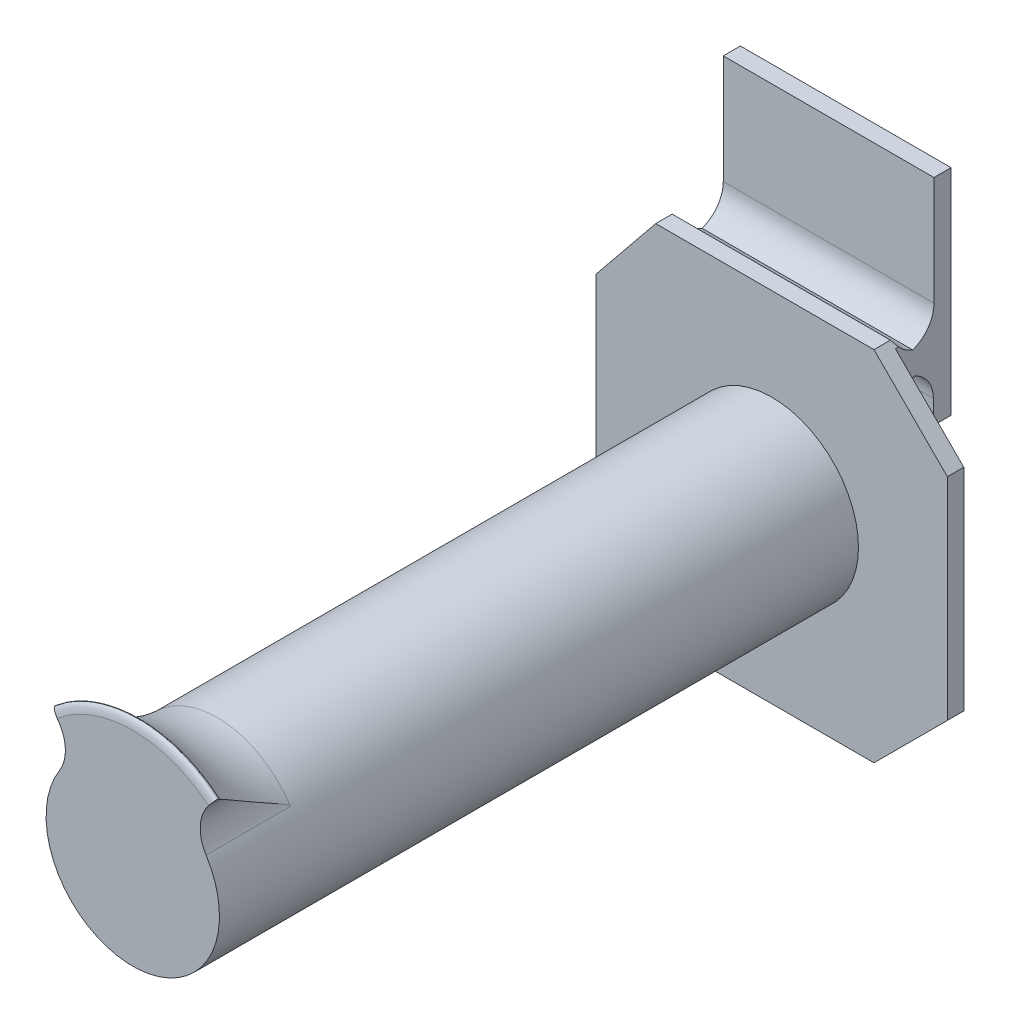
ISO-10303-21;
HEADER;
FILE_DESCRIPTION(('STEP AP214'),'2;1');
FILE_NAME('part.step','',(''),(''),'','','');
FILE_SCHEMA(('AUTOMOTIVE_DESIGN { 1 0 10303 214 1 1 1 1 }'));
ENDSEC;
DATA;
#1=APPLICATION_CONTEXT('core data for automotive mechanical design processes');
#2=APPLICATION_PROTOCOL_DEFINITION('international standard','automotive_design',2000,#1);
#3=PRODUCT_CONTEXT('',#1,'mechanical');
#4=PRODUCT('Part','Part','',(#3));
#5=PRODUCT_RELATED_PRODUCT_CATEGORY('part','',(#4));
#6=PRODUCT_DEFINITION_FORMATION('','',#4);
#7=PRODUCT_DEFINITION_CONTEXT('part definition',#1,'design');
#8=PRODUCT_DEFINITION('design','',#6,#7);
#9=PRODUCT_DEFINITION_SHAPE('','',#8);
#10=(LENGTH_UNIT() NAMED_UNIT(*) SI_UNIT(.MILLI.,.METRE.));
#11=(NAMED_UNIT(*) PLANE_ANGLE_UNIT() SI_UNIT($,.RADIAN.));
#12=(NAMED_UNIT(*) SI_UNIT($,.STERADIAN.) SOLID_ANGLE_UNIT());
#13=UNCERTAINTY_MEASURE_WITH_UNIT(LENGTH_MEASURE(1.E-05),#10,'distance_accuracy_value','');
#14=(GEOMETRIC_REPRESENTATION_CONTEXT(3) GLOBAL_UNCERTAINTY_ASSIGNED_CONTEXT((#13)) GLOBAL_UNIT_ASSIGNED_CONTEXT((#10,
#11,#12)) REPRESENTATION_CONTEXT('',''));
#15=CARTESIAN_POINT('',(0.,0.,0.));
#16=DIRECTION('',(0.,0.,1.));
#17=DIRECTION('',(1.,0.,0.));
#18=AXIS2_PLACEMENT_3D('',#15,#16,#17);
#19=CARTESIAN_POINT('',(0.,0.,0.));
#20=DIRECTION('',(0.,0.,1.));
#21=DIRECTION('',(1.,0.,0.));
#22=AXIS2_PLACEMENT_3D('',#19,#20,#21);
#23=PLANE('',#22);
#24=CARTESIAN_POINT('',(0.,0.,0.));
#25=DIRECTION('',(0.,0.,1.));
#26=DIRECTION('',(1.,0.,0.));
#27=AXIS2_PLACEMENT_3D('',#24,#25,#26);
#28=CIRCLE('',#27,13.7);
#29=CARTESIAN_POINT('',(13.7,0.,0.));
#30=VERTEX_POINT('',#29);
#31=EDGE_CURVE('E414',#30,#30,#28,.T.);
#32=ORIENTED_EDGE('',*,*,#31,.F.);
#33=EDGE_LOOP('',(#32));
#34=FACE_BOUND('',#33,.T.);
#35=DIRECTION('',(0.,-1.,0.));
#36=VECTOR('',#35,1.);
#37=CARTESIAN_POINT('',(27.75,28.280672501964,0.));
#38=LINE('',#37,#36);
#39=CARTESIAN_POINT('',(27.75,16.6806725019641,0.));
#40=VERTEX_POINT('',#39);
#41=CARTESIAN_POINT('',(27.75,-16.6806725019641,0.));
#42=VERTEX_POINT('',#41);
#43=EDGE_CURVE('E419',#40,#42,#38,.T.);
#44=ORIENTED_EDGE('',*,*,#43,.F.);
#45=DIRECTION('',(0.707106781186551,-0.707106781186544,0.));
#46=VECTOR('',#45,1.);
#47=CARTESIAN_POINT('',(16.15,28.280672501964,0.));
#48=LINE('',#47,#46);
#49=CARTESIAN_POINT('',(16.15,28.280672501964,0.));
#50=VERTEX_POINT('',#49);
#51=EDGE_CURVE('E365',#50,#40,#48,.T.);
#52=ORIENTED_EDGE('',*,*,#51,.F.);
#53=DIRECTION('',(1.,0.,0.));
#54=VECTOR('',#53,1.);
#55=CARTESIAN_POINT('',(-27.75,28.280672501964,0.));
#56=LINE('',#55,#54);
#57=CARTESIAN_POINT('',(-18.35,28.280672501964,0.));
#58=VERTEX_POINT('',#57);
#59=EDGE_CURVE('E406',#58,#50,#56,.T.);
#60=ORIENTED_EDGE('',*,*,#59,.F.);
#61=DIRECTION('',(0.629583498277007,0.77693282766098,0.));
#62=VECTOR('',#61,1.);
#63=CARTESIAN_POINT('',(-24.9098354997943,20.1855563532818,0.));
#64=LINE('',#63,#62);
#65=CARTESIAN_POINT('',(-27.75,16.6806725019641,0.));
#66=VERTEX_POINT('',#65);
#67=EDGE_CURVE('E392',#66,#58,#64,.T.);
#68=ORIENTED_EDGE('',*,*,#67,.F.);
#69=DIRECTION('',(0.,-1.,0.));
#70=VECTOR('',#69,1.);
#71=CARTESIAN_POINT('',(-27.75,28.280672501964,0.));
#72=LINE('',#71,#70);
#73=CARTESIAN_POINT('',(-27.75,-18.8806725019639,0.));
#74=VERTEX_POINT('',#73);
#75=EDGE_CURVE('E399',#66,#74,#72,.T.);
#76=ORIENTED_EDGE('',*,*,#75,.T.);
#77=DIRECTION('',(-0.707106781186545,0.70710678118655,0.));
#78=VECTOR('',#77,1.);
#79=CARTESIAN_POINT('',(-23.315336250982,-23.3153362509819,0.));
#80=LINE('',#79,#78);
#81=CARTESIAN_POINT('',(-18.35,-28.280672501964,0.));
#82=VERTEX_POINT('',#81);
#83=EDGE_CURVE('E373',#82,#74,#80,.T.);
#84=ORIENTED_EDGE('',*,*,#83,.F.);
#85=DIRECTION('',(1.,0.,0.));
#86=VECTOR('',#85,1.);
#87=CARTESIAN_POINT('',(-27.75,-28.280672501964,0.));
#88=LINE('',#87,#86);
#89=CARTESIAN_POINT('',(16.15,-28.280672501964,0.));
#90=VERTEX_POINT('',#89);
#91=EDGE_CURVE('E417',#82,#90,#88,.T.);
#92=ORIENTED_EDGE('',*,*,#91,.T.);
#93=DIRECTION('',(0.707106781186551,0.707106781186544,0.));
#94=VECTOR('',#93,1.);
#95=CARTESIAN_POINT('',(22.2153362509819,-22.2153362509821,0.));
#96=LINE('',#95,#94);
#97=EDGE_CURVE('E383',#90,#42,#96,.T.);
#98=ORIENTED_EDGE('',*,*,#97,.T.);
#99=EDGE_LOOP('',(#44,#52,#60,#68,#76,#84,#92,#98));
#100=FACE_BOUND('',#99,.T.);
#101=ADVANCED_FACE('F35',(#34,#100),#23,.T.);
#102=CARTESIAN_POINT('',(0.,0.,-2.6));
#103=DIRECTION('',(0.,0.,1.));
#104=DIRECTION('',(1.,0.,0.));
#105=AXIS2_PLACEMENT_3D('',#102,#103,#104);
#106=PLANE('',#105);
#107=DIRECTION('',(1.,0.,0.));
#108=VECTOR('',#107,1.);
#109=CARTESIAN_POINT('',(-27.75,28.280672501964,-2.6));
#110=LINE('',#109,#108);
#111=CARTESIAN_POINT('',(-18.35,28.280672501964,-2.6));
#112=VERTEX_POINT('',#111);
#113=CARTESIAN_POINT('',(-16.3666459952623,28.280672501964,-2.6));
#114=VERTEX_POINT('',#113);
#115=EDGE_CURVE('E411',#112,#114,#110,.T.);
#116=ORIENTED_EDGE('',*,*,#115,.T.);
#117=DIRECTION('',(0.,-1.,0.));
#118=VECTOR('',#117,1.);
#119=CARTESIAN_POINT('',(-16.3666459952623,25.680672501964,-2.6));
#120=LINE('',#119,#118);
#121=CARTESIAN_POINT('',(-16.3666459952623,17.680672501964,-2.6));
#122=VERTEX_POINT('',#121);
#123=EDGE_CURVE('E354',#114,#122,#120,.T.);
#124=ORIENTED_EDGE('',*,*,#123,.T.);
#125=DIRECTION('',(1.,0.,0.));
#126=VECTOR('',#125,1.);
#127=CARTESIAN_POINT('',(0.,17.680672501964,-2.6));
#128=LINE('',#127,#126);
#129=CARTESIAN_POINT('',(16.9333540047377,17.680672501964,-2.6));
#130=VERTEX_POINT('',#129);
#131=EDGE_CURVE('E250',#122,#130,#128,.T.);
#132=ORIENTED_EDGE('',*,*,#131,.T.);
#133=DIRECTION('',(0.,1.,0.));
#134=VECTOR('',#133,1.);
#135=CARTESIAN_POINT('',(16.9333540047377,22.680672501964,-2.6));
#136=LINE('',#135,#134);
#137=CARTESIAN_POINT('',(16.9333540047377,27.4973184972263,-2.6));
#138=VERTEX_POINT('',#137);
#139=EDGE_CURVE('E357',#130,#138,#136,.T.);
#140=ORIENTED_EDGE('',*,*,#139,.T.);
#141=DIRECTION('',(0.707106781186551,-0.707106781186544,0.));
#142=VECTOR('',#141,1.);
#143=CARTESIAN_POINT('',(16.15,28.280672501964,-2.6));
#144=LINE('',#143,#142);
#145=CARTESIAN_POINT('',(27.75,16.6806725019641,-2.6));
#146=VERTEX_POINT('',#145);
#147=EDGE_CURVE('E366',#138,#146,#144,.T.);
#148=ORIENTED_EDGE('',*,*,#147,.T.);
#149=DIRECTION('',(0.,-1.,0.));
#150=VECTOR('',#149,1.);
#151=CARTESIAN_POINT('',(27.75,28.280672501964,-2.6));
#152=LINE('',#151,#150);
#153=CARTESIAN_POINT('',(27.75,-16.6806725019641,-2.6));
#154=VERTEX_POINT('',#153);
#155=EDGE_CURVE('E408',#146,#154,#152,.T.);
#156=ORIENTED_EDGE('',*,*,#155,.T.);
#157=DIRECTION('',(0.707106781186551,0.707106781186544,0.));
#158=VECTOR('',#157,1.);
#159=CARTESIAN_POINT('',(22.2153362509819,-22.2153362509821,-2.6));
#160=LINE('',#159,#158);
#161=CARTESIAN_POINT('',(16.15,-28.280672501964,-2.6));
#162=VERTEX_POINT('',#161);
#163=EDGE_CURVE('E386',#162,#154,#160,.T.);
#164=ORIENTED_EDGE('',*,*,#163,.F.);
#165=DIRECTION('',(1.,0.,0.));
#166=VECTOR('',#165,1.);
#167=CARTESIAN_POINT('',(-27.75,-28.280672501964,-2.6));
#168=LINE('',#167,#166);
#169=CARTESIAN_POINT('',(-18.35,-28.280672501964,-2.6));
#170=VERTEX_POINT('',#169);
#171=EDGE_CURVE('E405',#170,#162,#168,.T.);
#172=ORIENTED_EDGE('',*,*,#171,.F.);
#173=DIRECTION('',(-0.707106781186545,0.70710678118655,0.));
#174=VECTOR('',#173,1.);
#175=CARTESIAN_POINT('',(-23.315336250982,-23.3153362509819,-2.6));
#176=LINE('',#175,#174);
#177=CARTESIAN_POINT('',(-27.75,-18.8806725019639,-2.6));
#178=VERTEX_POINT('',#177);
#179=EDGE_CURVE('E375',#170,#178,#176,.T.);
#180=ORIENTED_EDGE('',*,*,#179,.T.);
#181=DIRECTION('',(0.,-1.,0.));
#182=VECTOR('',#181,1.);
#183=CARTESIAN_POINT('',(-27.75,28.280672501964,-2.6));
#184=LINE('',#183,#182);
#185=CARTESIAN_POINT('',(-27.75,16.6806725019641,-2.6));
#186=VERTEX_POINT('',#185);
#187=EDGE_CURVE('E402',#186,#178,#184,.T.);
#188=ORIENTED_EDGE('',*,*,#187,.F.);
#189=DIRECTION('',(0.629583498277007,0.77693282766098,0.));
#190=VECTOR('',#189,1.);
#191=CARTESIAN_POINT('',(-24.9098354997943,20.1855563532818,-2.6));
#192=LINE('',#191,#190);
#193=EDGE_CURVE('E389',#186,#112,#192,.T.);
#194=ORIENTED_EDGE('',*,*,#193,.T.);
#195=EDGE_LOOP('',(#116,#124,#132,#140,#148,#156,#164,#172,#180,#188,#194));
#196=FACE_BOUND('',#195,.T.);
#197=ADVANCED_FACE('F430',(#196),#106,.F.);
#198=CARTESIAN_POINT('',(-27.75,28.280672501964,-2.6));
#199=DIRECTION('',(0.,-1.,0.));
#200=DIRECTION('',(1.,0.,0.));
#201=AXIS2_PLACEMENT_3D('',#198,#199,#200);
#202=PLANE('',#201);
#203=DIRECTION('',(0.,0.,-1.));
#204=VECTOR('',#203,1.);
#205=CARTESIAN_POINT('',(16.15,28.280672501964,0.));
#206=LINE('',#205,#204);
#207=CARTESIAN_POINT('',(16.15,28.280672501964,-2.6));
#208=VERTEX_POINT('',#207);
#209=EDGE_CURVE('E362',#50,#208,#206,.T.);
#210=ORIENTED_EDGE('',*,*,#209,.T.);
#211=EDGE_CURVE('E410',#114,#208,#110,.T.);
#212=ORIENTED_EDGE('',*,*,#211,.F.);
#213=ORIENTED_EDGE('',*,*,#115,.F.);
#214=DIRECTION('',(0.,0.,-1.));
#215=VECTOR('',#214,1.);
#216=CARTESIAN_POINT('',(-18.35,28.280672501964,0.));
#217=LINE('',#216,#215);
#218=EDGE_CURVE('E397',#58,#112,#217,.T.);
#219=ORIENTED_EDGE('',*,*,#218,.F.);
#220=ORIENTED_EDGE('',*,*,#59,.T.);
#221=EDGE_LOOP('',(#210,#212,#213,#219,#220));
#222=FACE_BOUND('',#221,.T.);
#223=ADVANCED_FACE('F444',(#222),#202,.F.);
#224=CARTESIAN_POINT('',(27.75,28.280672501964,-2.6));
#225=DIRECTION('',(-1.,0.,0.));
#226=DIRECTION('',(0.,-1.,0.));
#227=AXIS2_PLACEMENT_3D('',#224,#225,#226);
#228=PLANE('',#227);
#229=DIRECTION('',(0.,0.,-1.));
#230=VECTOR('',#229,1.);
#231=CARTESIAN_POINT('',(27.75,16.6806725019641,0.));
#232=LINE('',#231,#230);
#233=EDGE_CURVE('E359',#40,#146,#232,.T.);
#234=ORIENTED_EDGE('',*,*,#233,.F.);
#235=ORIENTED_EDGE('',*,*,#43,.T.);
#236=DIRECTION('',(0.,0.,-1.));
#237=VECTOR('',#236,1.);
#238=CARTESIAN_POINT('',(27.75,-16.6806725019641,0.));
#239=LINE('',#238,#237);
#240=EDGE_CURVE('E378',#42,#154,#239,.T.);
#241=ORIENTED_EDGE('',*,*,#240,.T.);
#242=ORIENTED_EDGE('',*,*,#155,.F.);
#243=EDGE_LOOP('',(#234,#235,#241,#242));
#244=FACE_BOUND('',#243,.T.);
#245=ADVANCED_FACE('F468',(#244),#228,.F.);
#246=CARTESIAN_POINT('',(-27.75,28.280672501964,-2.6));
#247=DIRECTION('',(-1.,0.,0.));
#248=DIRECTION('',(0.,-1.,0.));
#249=AXIS2_PLACEMENT_3D('',#246,#247,#248);
#250=PLANE('',#249);
#251=ORIENTED_EDGE('',*,*,#187,.T.);
#252=DIRECTION('',(0.,0.,-1.));
#253=VECTOR('',#252,1.);
#254=CARTESIAN_POINT('',(-27.75,-18.8806725019639,0.));
#255=LINE('',#254,#253);
#256=EDGE_CURVE('E368',#74,#178,#255,.T.);
#257=ORIENTED_EDGE('',*,*,#256,.F.);
#258=ORIENTED_EDGE('',*,*,#75,.F.);
#259=DIRECTION('',(0.,0.,-1.));
#260=VECTOR('',#259,1.);
#261=CARTESIAN_POINT('',(-27.75,16.6806725019641,0.));
#262=LINE('',#261,#260);
#263=EDGE_CURVE('E394',#66,#186,#262,.T.);
#264=ORIENTED_EDGE('',*,*,#263,.T.);
#265=EDGE_LOOP('',(#251,#257,#258,#264));
#266=FACE_BOUND('',#265,.T.);
#267=ADVANCED_FACE('F480',(#266),#250,.T.);
#268=CARTESIAN_POINT('',(-27.75,-28.280672501964,-2.6));
#269=DIRECTION('',(0.,-1.,0.));
#270=DIRECTION('',(1.,0.,0.));
#271=AXIS2_PLACEMENT_3D('',#268,#269,#270);
#272=PLANE('',#271);
#273=ORIENTED_EDGE('',*,*,#91,.F.);
#274=DIRECTION('',(0.,0.,-1.));
#275=VECTOR('',#274,1.);
#276=CARTESIAN_POINT('',(-18.35,-28.280672501964,0.));
#277=LINE('',#276,#275);
#278=EDGE_CURVE('E370',#82,#170,#277,.T.);
#279=ORIENTED_EDGE('',*,*,#278,.T.);
#280=ORIENTED_EDGE('',*,*,#171,.T.);
#281=DIRECTION('',(0.,0.,-1.));
#282=VECTOR('',#281,1.);
#283=CARTESIAN_POINT('',(16.15,-28.280672501964,0.));
#284=LINE('',#283,#282);
#285=EDGE_CURVE('E380',#90,#162,#284,.T.);
#286=ORIENTED_EDGE('',*,*,#285,.F.);
#287=EDGE_LOOP('',(#273,#279,#280,#286));
#288=FACE_BOUND('',#287,.T.);
#289=ADVANCED_FACE('F476',(#288),#272,.T.);
#290=CARTESIAN_POINT('',(0.,0.,101.));
#291=DIRECTION('',(0.,0.,-1.));
#292=DIRECTION('',(-1.,0.,0.));
#293=AXIS2_PLACEMENT_3D('',#290,#291,#292);
#294=CYLINDRICAL_SURFACE('',#293,13.7);
#295=CARTESIAN_POINT('',(0.,0.,101.));
#296=DIRECTION('',(0.,0.,1.));
#297=DIRECTION('',(1.,0.,0.));
#298=AXIS2_PLACEMENT_3D('',#295,#296,#297);
#299=CIRCLE('',#298,13.7);
#300=CARTESIAN_POINT('',(-11.5842003946146,7.31411657122104,101.));
#301=VERTEX_POINT('',#300);
#302=CARTESIAN_POINT('',(11.5842003946146,7.31411657122103,101.));
#303=VERTEX_POINT('',#302);
#304=EDGE_CURVE('E424',#301,#303,#299,.T.);
#305=ORIENTED_EDGE('',*,*,#304,.F.);
#306=DIRECTION('',(0.,0.,-1.));
#307=VECTOR('',#306,1.);
#308=CARTESIAN_POINT('',(-11.5842003946146,7.31411657122104,101.));
#309=LINE('',#308,#307);
#310=CARTESIAN_POINT('',(-11.5842003946146,7.31411657122104,87.6723106299124));
#311=VERTEX_POINT('',#310);
#312=EDGE_CURVE('E745',#301,#311,#309,.T.);
#313=ORIENTED_EDGE('',*,*,#312,.T.);
#314=CARTESIAN_POINT('',(0.,0.,87.6723106299124));
#315=DIRECTION('',(0.,0.,1.));
#316=DIRECTION('',(1.,0.,0.));
#317=AXIS2_PLACEMENT_3D('',#314,#315,#316);
#318=CIRCLE('',#317,13.7);
#319=CARTESIAN_POINT('',(11.5842003946146,7.31411657122103,87.6723106299124));
#320=VERTEX_POINT('',#319);
#321=EDGE_CURVE('E323',#320,#311,#318,.T.);
#322=ORIENTED_EDGE('',*,*,#321,.F.);
#323=DIRECTION('',(0.,0.,-1.));
#324=VECTOR('',#323,1.);
#325=CARTESIAN_POINT('',(11.5842003946146,7.31411657122103,101.));
#326=LINE('',#325,#324);
#327=EDGE_CURVE('E278',#320,#303,#326,.F.);
#328=ORIENTED_EDGE('',*,*,#327,.T.);
#329=EDGE_LOOP('',(#305,#313,#322,#328));
#330=FACE_BOUND('',#329,.T.);
#331=ORIENTED_EDGE('',*,*,#31,.T.);
#332=EDGE_LOOP('',(#331));
#333=FACE_BOUND('',#332,.T.);
#334=ADVANCED_FACE('F510',(#330,#333),#294,.T.);
#335=CARTESIAN_POINT('',(0.,0.,101.));
#336=DIRECTION('',(0.,0.,1.));
#337=DIRECTION('',(1.,0.,0.));
#338=AXIS2_PLACEMENT_3D('',#335,#336,#337);
#339=PLANE('',#338);
#340=CARTESIAN_POINT('',(0.,0.,101.));
#341=DIRECTION('',(0.,0.,1.));
#342=DIRECTION('',(1.,0.,0.));
#343=AXIS2_PLACEMENT_3D('',#340,#341,#342);
#344=CIRCLE('',#343,18.6075288080616);
#345=CARTESIAN_POINT('',(11.9622533249894,14.25288124316,101.));
#346=VERTEX_POINT('',#345);
#347=CARTESIAN_POINT('',(-11.9622533249894,14.25288124316,101.));
#348=VERTEX_POINT('',#347);
#349=EDGE_CURVE('E62',#346,#348,#344,.T.);
#350=ORIENTED_EDGE('',*,*,#349,.T.);
#351=CARTESIAN_POINT('',(-16.6575728302123,10.5173793031427,101.));
#352=DIRECTION('',(0.,0.,1.));
#353=DIRECTION('',(1.,0.,0.));
#354=AXIS2_PLACEMENT_3D('',#351,#352,#353);
#355=CIRCLE('',#354,6.);
#356=EDGE_CURVE('E747',#348,#301,#355,.F.);
#357=ORIENTED_EDGE('',*,*,#356,.T.);
#358=ORIENTED_EDGE('',*,*,#304,.T.);
#359=CARTESIAN_POINT('',(16.6575728302123,10.5173793031426,101.));
#360=DIRECTION('',(0.,0.,1.));
#361=DIRECTION('',(1.,0.,0.));
#362=AXIS2_PLACEMENT_3D('',#359,#360,#361);
#363=CIRCLE('',#362,6.);
#364=EDGE_CURVE('E288',#303,#346,#363,.F.);
#365=ORIENTED_EDGE('',*,*,#364,.T.);
#366=EDGE_LOOP('',(#350,#357,#358,#365));
#367=FACE_BOUND('',#366,.T.);
#368=ADVANCED_FACE('F513',(#367),#339,.T.);
#369=CARTESIAN_POINT('',(-24.9098354997943,20.1855563532818,0.));
#370=DIRECTION('',(-0.77693282766098,0.629583498277007,0.));
#371=DIRECTION('',(-0.629583498277007,-0.77693282766098,0.));
#372=AXIS2_PLACEMENT_3D('',#369,#370,#371);
#373=PLANE('',#372);
#374=ORIENTED_EDGE('',*,*,#193,.F.);
#375=ORIENTED_EDGE('',*,*,#263,.F.);
#376=ORIENTED_EDGE('',*,*,#67,.T.);
#377=ORIENTED_EDGE('',*,*,#218,.T.);
#378=EDGE_LOOP('',(#374,#375,#376,#377));
#379=FACE_BOUND('',#378,.T.);
#380=ADVANCED_FACE('F484',(#379),#373,.T.);
#381=CARTESIAN_POINT('',(22.2153362509819,-22.2153362509821,0.));
#382=DIRECTION('',(-0.707106781186544,0.707106781186551,0.));
#383=DIRECTION('',(-0.707106781186551,-0.707106781186544,0.));
#384=AXIS2_PLACEMENT_3D('',#381,#382,#383);
#385=PLANE('',#384);
#386=ORIENTED_EDGE('',*,*,#163,.T.);
#387=ORIENTED_EDGE('',*,*,#240,.F.);
#388=ORIENTED_EDGE('',*,*,#97,.F.);
#389=ORIENTED_EDGE('',*,*,#285,.T.);
#390=EDGE_LOOP('',(#386,#387,#388,#389));
#391=FACE_BOUND('',#390,.T.);
#392=ADVANCED_FACE('F465',(#391),#385,.F.);
#393=CARTESIAN_POINT('',(-23.315336250982,-23.3153362509819,0.));
#394=DIRECTION('',(-0.70710678118655,-0.707106781186545,0.));
#395=DIRECTION('',(0.707106781186545,-0.70710678118655,0.));
#396=AXIS2_PLACEMENT_3D('',#393,#394,#395);
#397=PLANE('',#396);
#398=ORIENTED_EDGE('',*,*,#179,.F.);
#399=ORIENTED_EDGE('',*,*,#278,.F.);
#400=ORIENTED_EDGE('',*,*,#83,.T.);
#401=ORIENTED_EDGE('',*,*,#256,.T.);
#402=EDGE_LOOP('',(#398,#399,#400,#401));
#403=FACE_BOUND('',#402,.T.);
#404=ADVANCED_FACE('F485',(#403),#397,.T.);
#405=CARTESIAN_POINT('',(16.15,28.280672501964,0.));
#406=DIRECTION('',(0.707106781186544,0.707106781186551,0.));
#407=DIRECTION('',(-0.707106781186551,0.707106781186544,0.));
#408=AXIS2_PLACEMENT_3D('',#405,#406,#407);
#409=PLANE('',#408);
#410=ORIENTED_EDGE('',*,*,#147,.F.);
#411=DIRECTION('',(0.,0.,-1.));
#412=VECTOR('',#411,1.);
#413=CARTESIAN_POINT('',(16.9333540047377,27.4973184972263,0.));
#414=LINE('',#413,#412);
#415=CARTESIAN_POINT('',(16.9333540047377,27.4973184972263,-3.13066386400961));
#416=VERTEX_POINT('',#415);
#417=EDGE_CURVE('E275',#138,#416,#414,.T.);
#418=ORIENTED_EDGE('',*,*,#417,.T.);
#419=CARTESIAN_POINT('',(13.75,30.680672501964,-6.98634243989226));
#420=DIRECTION('',(0.707106781186544,0.707106781186551,0.));
#421=DIRECTION('',(0.707106781186551,-0.707106781186544,0.));
#422=AXIS2_PLACEMENT_3D('',#419,#420,#421);
#423=ELLIPSE('',#422,7.07106781186551,5.);
#424=EDGE_CURVE('E256',#416,#208,#423,.F.);
#425=ORIENTED_EDGE('',*,*,#424,.T.);
#426=ORIENTED_EDGE('',*,*,#209,.F.);
#427=ORIENTED_EDGE('',*,*,#51,.T.);
#428=ORIENTED_EDGE('',*,*,#233,.T.);
#429=EDGE_LOOP('',(#410,#418,#425,#426,#427,#428));
#430=FACE_BOUND('',#429,.T.);
#431=ADVANCED_FACE('F457',(#430),#409,.T.);
#432=CARTESIAN_POINT('',(-16.3666459952623,25.680672501964,-8.6));
#433=DIRECTION('',(-1.,0.,0.));
#434=DIRECTION('',(0.,0.,1.));
#435=AXIS2_PLACEMENT_3D('',#432,#433,#434);
#436=PLANE('',#435);
#437=ORIENTED_EDGE('',*,*,#123,.F.);
#438=CARTESIAN_POINT('',(-16.3666459952623,30.680672501964,-6.98634243989226));
#439=DIRECTION('',(-1.,0.,0.));
#440=DIRECTION('',(0.,0.,1.));
#441=AXIS2_PLACEMENT_3D('',#438,#439,#440);
#442=CIRCLE('',#441,5.);
#443=CARTESIAN_POINT('',(-16.3666459952623,25.9583861550828,-5.34317121994613));
#444=VERTEX_POINT('',#443);
#445=EDGE_CURVE('E259',#114,#444,#442,.F.);
#446=ORIENTED_EDGE('',*,*,#445,.T.);
#447=CARTESIAN_POINT('',(-16.3666459952623,30.680672501964,-3.7));
#448=DIRECTION('',(-1.,0.,0.));
#449=DIRECTION('',(0.,0.,1.));
#450=AXIS2_PLACEMENT_3D('',#447,#448,#449);
#451=CIRCLE('',#450,5.);
#452=CARTESIAN_POINT('',(-16.3666459952623,30.680672501964,-8.7));
#453=VERTEX_POINT('',#452);
#454=EDGE_CURVE('E228',#444,#453,#451,.F.);
#455=ORIENTED_EDGE('',*,*,#454,.T.);
#456=DIRECTION('',(0.,-1.,0.));
#457=VECTOR('',#456,1.);
#458=CARTESIAN_POINT('',(-16.3666459952623,47.880672501964,-8.7));
#459=LINE('',#458,#457);
#460=CARTESIAN_POINT('',(-16.3666459952623,47.880672501964,-8.7));
#461=VERTEX_POINT('',#460);
#462=EDGE_CURVE('E207',#461,#453,#459,.T.);
#463=ORIENTED_EDGE('',*,*,#462,.F.);
#464=DIRECTION('',(0.,0.,1.));
#465=VECTOR('',#464,1.);
#466=CARTESIAN_POINT('',(-16.3666459952623,47.880672501964,-11.4));
#467=LINE('',#466,#465);
#468=CARTESIAN_POINT('',(-16.3666459952623,47.880672501964,-11.4));
#469=VERTEX_POINT('',#468);
#470=EDGE_CURVE('E215',#469,#461,#467,.T.);
#471=ORIENTED_EDGE('',*,*,#470,.F.);
#472=DIRECTION('',(0.,1.,0.));
#473=VECTOR('',#472,1.);
#474=CARTESIAN_POINT('',(-16.3666459952623,25.680672501964,-11.4));
#475=LINE('',#474,#473);
#476=CARTESIAN_POINT('',(-16.3666459952623,13.980672501964,-11.4));
#477=VERTEX_POINT('',#476);
#478=EDGE_CURVE('E242',#477,#469,#475,.T.);
#479=ORIENTED_EDGE('',*,*,#478,.F.);
#480=DIRECTION('',(0.,0.,1.));
#481=VECTOR('',#480,1.);
#482=CARTESIAN_POINT('',(-16.3666459952623,13.980672501964,-11.4));
#483=LINE('',#482,#481);
#484=CARTESIAN_POINT('',(-16.3666459952623,13.980672501964,-8.6));
#485=VERTEX_POINT('',#484);
#486=EDGE_CURVE('E244',#477,#485,#483,.T.);
#487=ORIENTED_EDGE('',*,*,#486,.T.);
#488=DIRECTION('',(0.,1.,0.));
#489=VECTOR('',#488,1.);
#490=CARTESIAN_POINT('',(-16.3666459952623,25.680672501964,-8.6));
#491=LINE('',#490,#489);
#492=CARTESIAN_POINT('',(-16.3666459952623,17.680672501964,-8.6));
#493=VERTEX_POINT('',#492);
#494=EDGE_CURVE('E240',#485,#493,#491,.T.);
#495=ORIENTED_EDGE('',*,*,#494,.T.);
#496=CARTESIAN_POINT('',(-16.3666459952623,17.680672501964,-3.6));
#497=DIRECTION('',(-1.,0.,0.));
#498=DIRECTION('',(0.,0.,1.));
#499=AXIS2_PLACEMENT_3D('',#496,#497,#498);
#500=CIRCLE('',#499,5.);
#501=CARTESIAN_POINT('',(-16.3666459952623,22.2632481969198,-5.6));
#502=VERTEX_POINT('',#501);
#503=EDGE_CURVE('E270',#493,#502,#500,.F.);
#504=ORIENTED_EDGE('',*,*,#503,.T.);
#505=CARTESIAN_POINT('',(-16.3666459952623,17.680672501964,-7.6));
#506=DIRECTION('',(-1.,0.,0.));
#507=DIRECTION('',(0.,0.,1.));
#508=AXIS2_PLACEMENT_3D('',#505,#506,#507);
#509=CIRCLE('',#508,5.);
#510=EDGE_CURVE('E265',#502,#122,#509,.F.);
#511=ORIENTED_EDGE('',*,*,#510,.T.);
#512=EDGE_LOOP('',(#437,#446,#455,#463,#471,#479,#487,#495,#504,#511));
#513=FACE_BOUND('',#512,.T.);
#514=ADVANCED_FACE('F226',(#513),#436,.T.);
#515=CARTESIAN_POINT('',(16.9333540047377,22.680672501964,-8.6));
#516=DIRECTION('',(1.,0.,0.));
#517=DIRECTION('',(0.,0.,-1.));
#518=AXIS2_PLACEMENT_3D('',#515,#516,#517);
#519=PLANE('',#518);
#520=ORIENTED_EDGE('',*,*,#139,.F.);
#521=CARTESIAN_POINT('',(16.9333540047377,17.680672501964,-7.6));
#522=DIRECTION('',(1.,0.,0.));
#523=DIRECTION('',(0.,0.,-1.));
#524=AXIS2_PLACEMENT_3D('',#521,#522,#523);
#525=CIRCLE('',#524,5.);
#526=CARTESIAN_POINT('',(16.9333540047377,22.2632481969198,-5.6));
#527=VERTEX_POINT('',#526);
#528=EDGE_CURVE('E263',#130,#527,#525,.F.);
#529=ORIENTED_EDGE('',*,*,#528,.T.);
#530=CARTESIAN_POINT('',(16.9333540047377,17.680672501964,-3.6));
#531=DIRECTION('',(1.,0.,0.));
#532=DIRECTION('',(0.,0.,-1.));
#533=AXIS2_PLACEMENT_3D('',#530,#531,#532);
#534=CIRCLE('',#533,5.);
#535=CARTESIAN_POINT('',(16.9333540047377,17.680672501964,-8.6));
#536=VERTEX_POINT('',#535);
#537=EDGE_CURVE('E268',#527,#536,#534,.F.);
#538=ORIENTED_EDGE('',*,*,#537,.T.);
#539=DIRECTION('',(0.,-1.,0.));
#540=VECTOR('',#539,1.);
#541=CARTESIAN_POINT('',(16.9333540047377,25.680672501964,-8.6));
#542=LINE('',#541,#540);
#543=CARTESIAN_POINT('',(16.9333540047377,13.980672501964,-8.6));
#544=VERTEX_POINT('',#543);
#545=EDGE_CURVE('E229',#536,#544,#542,.T.);
#546=ORIENTED_EDGE('',*,*,#545,.T.);
#547=DIRECTION('',(0.,0.,1.));
#548=VECTOR('',#547,1.);
#549=CARTESIAN_POINT('',(16.9333540047377,13.980672501964,-11.4));
#550=LINE('',#549,#548);
#551=CARTESIAN_POINT('',(16.9333540047377,13.980672501964,-11.4));
#552=VERTEX_POINT('',#551);
#553=EDGE_CURVE('E343',#552,#544,#550,.T.);
#554=ORIENTED_EDGE('',*,*,#553,.F.);
#555=DIRECTION('',(0.,-1.,0.));
#556=VECTOR('',#555,1.);
#557=CARTESIAN_POINT('',(16.9333540047377,25.680672501964,-11.4));
#558=LINE('',#557,#556);
#559=CARTESIAN_POINT('',(16.9333540047377,47.880672501964,-11.4));
#560=VERTEX_POINT('',#559);
#561=EDGE_CURVE('E236',#560,#552,#558,.T.);
#562=ORIENTED_EDGE('',*,*,#561,.F.);
#563=DIRECTION('',(0.,0.,-1.));
#564=VECTOR('',#563,1.);
#565=CARTESIAN_POINT('',(16.9333540047377,47.880672501964,-11.4));
#566=LINE('',#565,#564);
#567=CARTESIAN_POINT('',(16.9333540047377,47.880672501964,-8.7));
#568=VERTEX_POINT('',#567);
#569=EDGE_CURVE('E214',#568,#560,#566,.T.);
#570=ORIENTED_EDGE('',*,*,#569,.F.);
#571=DIRECTION('',(0.,-1.,0.));
#572=VECTOR('',#571,1.);
#573=CARTESIAN_POINT('',(16.9333540047377,47.880672501964,-8.7));
#574=LINE('',#573,#572);
#575=CARTESIAN_POINT('',(16.9333540047377,30.680672501964,-8.7));
#576=VERTEX_POINT('',#575);
#577=EDGE_CURVE('E210',#568,#576,#574,.T.);
#578=ORIENTED_EDGE('',*,*,#577,.T.);
#579=CARTESIAN_POINT('',(16.9333540047377,30.680672501964,-3.7));
#580=DIRECTION('',(1.,0.,0.));
#581=DIRECTION('',(0.,0.,-1.));
#582=AXIS2_PLACEMENT_3D('',#579,#580,#581);
#583=CIRCLE('',#582,5.);
#584=CARTESIAN_POINT('',(16.9333540047377,25.9583861550828,-5.34317121994613));
#585=VERTEX_POINT('',#584);
#586=EDGE_CURVE('E272',#576,#585,#583,.F.);
#587=ORIENTED_EDGE('',*,*,#586,.T.);
#588=CARTESIAN_POINT('',(16.9333540047377,30.680672501964,-6.98634243989226));
#589=DIRECTION('',(1.,0.,0.));
#590=DIRECTION('',(0.,0.,-1.));
#591=AXIS2_PLACEMENT_3D('',#588,#589,#590);
#592=CIRCLE('',#591,5.);
#593=EDGE_CURVE('E261',#585,#416,#592,.F.);
#594=ORIENTED_EDGE('',*,*,#593,.T.);
#595=ORIENTED_EDGE('',*,*,#417,.F.);
#596=EDGE_LOOP('',(#520,#529,#538,#546,#554,#562,#570,#578,#587,#594,#595));
#597=FACE_BOUND('',#596,.T.);
#598=ADVANCED_FACE('F437',(#597),#519,.T.);
#599=CARTESIAN_POINT('',(16.9333540047377,13.980672501964,-11.4));
#600=DIRECTION('',(0.,1.,0.));
#601=DIRECTION('',(0.,0.,1.));
#602=AXIS2_PLACEMENT_3D('',#599,#600,#601);
#603=PLANE('',#602);
#604=DIRECTION('',(-1.,0.,0.));
#605=VECTOR('',#604,1.);
#606=CARTESIAN_POINT('',(16.9333540047377,13.980672501964,-8.6));
#607=LINE('',#606,#605);
#608=EDGE_CURVE('E231',#544,#485,#607,.T.);
#609=ORIENTED_EDGE('',*,*,#608,.T.);
#610=ORIENTED_EDGE('',*,*,#486,.F.);
#611=DIRECTION('',(-1.,0.,0.));
#612=VECTOR('',#611,1.);
#613=CARTESIAN_POINT('',(16.9333540047377,13.980672501964,-11.4));
#614=LINE('',#613,#612);
#615=EDGE_CURVE('E239',#552,#477,#614,.T.);
#616=ORIENTED_EDGE('',*,*,#615,.F.);
#617=ORIENTED_EDGE('',*,*,#553,.T.);
#618=EDGE_LOOP('',(#609,#610,#616,#617));
#619=FACE_BOUND('',#618,.T.);
#620=ADVANCED_FACE('F629',(#619),#603,.F.);
#621=CARTESIAN_POINT('',(0.,0.,-11.4));
#622=DIRECTION('',(0.,0.,-1.));
#623=DIRECTION('',(-1.,0.,0.));
#624=AXIS2_PLACEMENT_3D('',#621,#622,#623);
#625=PLANE('',#624);
#626=ORIENTED_EDGE('',*,*,#561,.T.);
#627=ORIENTED_EDGE('',*,*,#615,.T.);
#628=ORIENTED_EDGE('',*,*,#478,.T.);
#629=DIRECTION('',(-1.,0.,0.));
#630=VECTOR('',#629,1.);
#631=CARTESIAN_POINT('',(-16.3666459952623,47.880672501964,-11.4));
#632=LINE('',#631,#630);
#633=EDGE_CURVE('E221',#560,#469,#632,.T.);
#634=ORIENTED_EDGE('',*,*,#633,.F.);
#635=EDGE_LOOP('',(#626,#627,#628,#634));
#636=FACE_BOUND('',#635,.T.);
#637=ADVANCED_FACE('F335',(#636),#625,.T.);
#638=CARTESIAN_POINT('',(0.,0.,-8.6));
#639=DIRECTION('',(0.,0.,-1.));
#640=DIRECTION('',(-1.,0.,0.));
#641=AXIS2_PLACEMENT_3D('',#638,#639,#640);
#642=PLANE('',#641);
#643=ORIENTED_EDGE('',*,*,#545,.F.);
#644=DIRECTION('',(1.,0.,0.));
#645=VECTOR('',#644,1.);
#646=CARTESIAN_POINT('',(0.,17.680672501964,-8.6));
#647=LINE('',#646,#645);
#648=EDGE_CURVE('E252',#536,#493,#647,.F.);
#649=ORIENTED_EDGE('',*,*,#648,.T.);
#650=ORIENTED_EDGE('',*,*,#494,.F.);
#651=ORIENTED_EDGE('',*,*,#608,.F.);
#652=EDGE_LOOP('',(#643,#649,#650,#651));
#653=FACE_BOUND('',#652,.T.);
#654=ADVANCED_FACE('F348',(#653),#642,.F.);
#655=CARTESIAN_POINT('',(-16.3666459952623,47.880672501964,-8.7));
#656=DIRECTION('',(0.,0.,-1.));
#657=DIRECTION('',(-1.,0.,0.));
#658=AXIS2_PLACEMENT_3D('',#655,#656,#657);
#659=PLANE('',#658);
#660=ORIENTED_EDGE('',*,*,#462,.T.);
#661=DIRECTION('',(1.,0.,0.));
#662=VECTOR('',#661,1.);
#663=CARTESIAN_POINT('',(-16.3666459952623,30.680672501964,-8.7));
#664=LINE('',#663,#662);
#665=EDGE_CURVE('E254',#453,#576,#664,.T.);
#666=ORIENTED_EDGE('',*,*,#665,.T.);
#667=ORIENTED_EDGE('',*,*,#577,.F.);
#668=DIRECTION('',(1.,0.,0.));
#669=VECTOR('',#668,1.);
#670=CARTESIAN_POINT('',(-16.3666459952623,47.880672501964,-8.7));
#671=LINE('',#670,#669);
#672=EDGE_CURVE('E203',#461,#568,#671,.T.);
#673=ORIENTED_EDGE('',*,*,#672,.F.);
#674=EDGE_LOOP('',(#660,#666,#667,#673));
#675=FACE_BOUND('',#674,.T.);
#676=ADVANCED_FACE('F205',(#675),#659,.F.);
#677=CARTESIAN_POINT('',(0.,47.880672501964,0.));
#678=DIRECTION('',(0.,1.,0.));
#679=DIRECTION('',(0.,0.,1.));
#680=AXIS2_PLACEMENT_3D('',#677,#678,#679);
#681=PLANE('',#680);
#682=ORIENTED_EDGE('',*,*,#470,.T.);
#683=ORIENTED_EDGE('',*,*,#672,.T.);
#684=ORIENTED_EDGE('',*,*,#569,.T.);
#685=ORIENTED_EDGE('',*,*,#633,.T.);
#686=EDGE_LOOP('',(#682,#683,#684,#685));
#687=FACE_BOUND('',#686,.T.);
#688=ADVANCED_FACE('F219',(#687),#681,.T.);
#689=CARTESIAN_POINT('',(-16.3666459952623,30.680672501964,-3.7));
#690=DIRECTION('',(1.,0.,0.));
#691=DIRECTION('',(0.,0.,-1.));
#692=AXIS2_PLACEMENT_3D('',#689,#690,#691);
#693=CYLINDRICAL_SURFACE('',#692,5.);
#694=DIRECTION('',(1.,0.,0.));
#695=VECTOR('',#694,1.);
#696=CARTESIAN_POINT('',(0.283354004737727,25.9583861550828,-5.34317121994613));
#697=LINE('',#696,#695);
#698=EDGE_CURVE('E224',#585,#444,#697,.F.);
#699=ORIENTED_EDGE('',*,*,#698,.F.);
#700=ORIENTED_EDGE('',*,*,#586,.F.);
#701=ORIENTED_EDGE('',*,*,#665,.F.);
#702=ORIENTED_EDGE('',*,*,#454,.F.);
#703=EDGE_LOOP('',(#699,#700,#701,#702));
#704=FACE_BOUND('',#703,.T.);
#705=ADVANCED_FACE('F454',(#704),#693,.F.);
#706=CARTESIAN_POINT('',(0.,30.680672501964,-6.98634243989226));
#707=DIRECTION('',(1.,0.,0.));
#708=DIRECTION('',(0.,1.,0.));
#709=AXIS2_PLACEMENT_3D('',#706,#707,#708);
#710=CYLINDRICAL_SURFACE('',#709,5.);
#711=ORIENTED_EDGE('',*,*,#593,.F.);
#712=ORIENTED_EDGE('',*,*,#698,.T.);
#713=ORIENTED_EDGE('',*,*,#445,.F.);
#714=ORIENTED_EDGE('',*,*,#211,.T.);
#715=ORIENTED_EDGE('',*,*,#424,.F.);
#716=EDGE_LOOP('',(#711,#712,#713,#714,#715));
#717=FACE_BOUND('',#716,.T.);
#718=ADVANCED_FACE('F450',(#717),#710,.F.);
#719=CARTESIAN_POINT('',(-16.3666459952623,17.680672501964,-3.6));
#720=DIRECTION('',(1.,0.,0.));
#721=DIRECTION('',(0.,1.,0.));
#722=AXIS2_PLACEMENT_3D('',#719,#720,#721);
#723=CYLINDRICAL_SURFACE('',#722,5.);
#724=DIRECTION('',(1.,0.,0.));
#725=VECTOR('',#724,1.);
#726=CARTESIAN_POINT('',(0.283354004737728,22.2632481969198,-5.6));
#727=LINE('',#726,#725);
#728=EDGE_CURVE('E281',#502,#527,#727,.T.);
#729=ORIENTED_EDGE('',*,*,#728,.F.);
#730=ORIENTED_EDGE('',*,*,#503,.F.);
#731=ORIENTED_EDGE('',*,*,#648,.F.);
#732=ORIENTED_EDGE('',*,*,#537,.F.);
#733=EDGE_LOOP('',(#729,#730,#731,#732));
#734=FACE_BOUND('',#733,.T.);
#735=ADVANCED_FACE('F439',(#734),#723,.F.);
#736=CARTESIAN_POINT('',(0.,17.680672501964,-7.6));
#737=DIRECTION('',(1.,0.,0.));
#738=DIRECTION('',(0.,1.,0.));
#739=AXIS2_PLACEMENT_3D('',#736,#737,#738);
#740=CYLINDRICAL_SURFACE('',#739,5.);
#741=ORIENTED_EDGE('',*,*,#510,.F.);
#742=ORIENTED_EDGE('',*,*,#728,.T.);
#743=ORIENTED_EDGE('',*,*,#528,.F.);
#744=ORIENTED_EDGE('',*,*,#131,.F.);
#745=EDGE_LOOP('',(#741,#742,#743,#744));
#746=FACE_BOUND('',#745,.T.);
#747=ADVANCED_FACE('F310',(#746),#740,.F.);
#748=CARTESIAN_POINT('',(11.9606889647074,14.2541940435919,101.));
#749=CARTESIAN_POINT('',(13.6800700978201,16.3032726860176,100.718827969597));
#750=CARTESIAN_POINT('',(11.9606889647074,14.2541940435919,99.2891622180894));
#751=B_SPLINE_CURVE_WITH_KNOTS('',2,(#748,#749,#750),.UNSPECIFIED.,.F.,.F.,(3,3),(0.,1.),.UNSPECIFIED.);
#752=CARTESIAN_POINT('',(0.,0.,101.10076407517));
#753=DIRECTION('',(0.,0.,1.));
#754=AXIS1_PLACEMENT('',#752,#753);
#755=SURFACE_OF_REVOLUTION('',#751,#754);
#756=CARTESIAN_POINT('',(0.,0.,99.2891622180894));
#757=DIRECTION('',(0.,0.,1.));
#758=DIRECTION('',(1.,0.,0.));
#759=AXIS2_PLACEMENT_3D('',#756,#757,#758);
#760=CIRCLE('',#759,18.6075288080616);
#761=CARTESIAN_POINT('',(11.9622533249894,14.25288124316,99.2891622180894));
#762=VERTEX_POINT('',#761);
#763=CARTESIAN_POINT('',(-11.9622533249894,14.25288124316,99.2891622180894));
#764=VERTEX_POINT('',#763);
#765=EDGE_CURVE('E54',#762,#764,#760,.T.);
#766=ORIENTED_EDGE('',*,*,#765,.T.);
#767=CARTESIAN_POINT('',(-11.9622533249894,14.25288124316,99.2891622180894));
#768=CARTESIAN_POINT('',(-11.9785702933275,14.2733883689997,99.3031573514471));
#769=CARTESIAN_POINT('',(-11.9949831811296,14.293743908139,99.3172566241854));
#770=CARTESIAN_POINT('',(-12.028000795662,14.3341518130169,99.3456634484231));
#771=CARTESIAN_POINT('',(-12.0446055223923,14.3542041787555,99.3599709999225));
#772=CARTESIAN_POINT('',(-12.0613061685866,14.3741049577936,99.3743826908024));
#773=B_SPLINE_CURVE_WITH_KNOTS('',3,(#767,#768,#769,#770,#771,#772),.UNSPECIFIED.,.F.,.F.,(4,2,
4),(0.,0.0891217322691988,0.178243464538405),.UNSPECIFIED.);
#774=CARTESIAN_POINT('',(-12.0613061589636,14.3741049463236,99.3743826824927));
#775=VERTEX_POINT('',#774);
#776=EDGE_CURVE('E11',#764,#775,#773,.T.);
#777=ORIENTED_EDGE('',*,*,#776,.T.);
#778=CARTESIAN_POINT('',(-11.9606889647074,14.2541940435919,101.));
#779=CARTESIAN_POINT('',(-13.6800700978201,16.3032726860176,100.718827969597));
#780=CARTESIAN_POINT('',(-11.9606889647074,14.2541940435919,99.2891622180894));
#781=B_SPLINE_CURVE_WITH_KNOTS('',2,(#778,#779,#780),.UNSPECIFIED.,.F.,.F.,(3,3),(0.,1.),.UNSPECIFIED.);
#782=CARTESIAN_POINT('',(-12.0613061589636,14.3741049463236,100.981988727098));
#783=VERTEX_POINT('',#782);
#784=EDGE_CURVE('E324',#783,#775,#781,.T.);
#785=ORIENTED_EDGE('',*,*,#784,.F.);
#786=CARTESIAN_POINT('',(-12.061306171401,14.3741049611458,100.981988725891));
#787=CARTESIAN_POINT('',(-12.0445530420658,14.3541399543183,100.985255172157));
#788=CARTESIAN_POINT('',(-12.0279220735305,14.3340554744057,100.988389334799));
#789=CARTESIAN_POINT('',(-11.99490445806,14.2936475684104,100.994393092836));
#790=CARTESIAN_POINT('',(-11.9785178111247,14.2733241423277,100.99726268823));
#791=CARTESIAN_POINT('',(-11.9622533249894,14.25288124316,101.));
#792=B_SPLINE_CURVE_WITH_KNOTS('',3,(#786,#787,#788,#789,#790,#791),.UNSPECIFIED.,.F.,.F.,(4,2,
4),(0.,0.0787920415347602,0.157584083069523),.UNSPECIFIED.);
#793=EDGE_CURVE('E748',#783,#348,#792,.T.);
#794=ORIENTED_EDGE('',*,*,#793,.T.);
#795=ORIENTED_EDGE('',*,*,#349,.F.);
#796=CARTESIAN_POINT('',(11.9622533249894,14.25288124316,101.));
#797=CARTESIAN_POINT('',(11.9785178111421,14.2733241423486,100.997262688431));
#798=CARTESIAN_POINT('',(11.9949044580793,14.2936475684336,100.994393093036));
#799=CARTESIAN_POINT('',(12.0279220735226,14.3340554743964,100.988389334597));
#800=CARTESIAN_POINT('',(12.0445530420287,14.3541399542742,100.985255171552));
#801=CARTESIAN_POINT('',(12.0613061713193,14.3741049610484,100.981988724682));
#802=B_SPLINE_CURVE_WITH_KNOTS('',3,(#796,#797,#798,#799,#800,#801),.UNSPECIFIED.,.F.,.F.,(4,2,
4),(0.,0.0787920415438003,0.157584083087603),.UNSPECIFIED.);
#803=CARTESIAN_POINT('',(12.0613061589636,14.3741049463235,100.981988727098));
#804=VERTEX_POINT('',#803);
#805=EDGE_CURVE('E290',#346,#804,#802,.T.);
#806=ORIENTED_EDGE('',*,*,#805,.T.);
#807=CARTESIAN_POINT('',(12.0613061589636,14.3741049463235,99.3743826824927));
#808=VERTEX_POINT('',#807);
#809=EDGE_CURVE('E316',#804,#808,#751,.T.);
#810=ORIENTED_EDGE('',*,*,#809,.T.);
#811=CARTESIAN_POINT('',(12.0613061700225,14.3741049595029,99.3743826866299));
#812=CARTESIAN_POINT('',(12.0446055231004,14.354204179598,99.3599709978277));
#813=CARTESIAN_POINT('',(12.0280007958866,14.3341518132837,99.345663447715));
#814=CARTESIAN_POINT('',(11.9949831808755,14.293743907836,99.3172566248681));
#815=CARTESIAN_POINT('',(11.9785702930783,14.2733883687027,99.3031573521341));
#816=CARTESIAN_POINT('',(11.9622533249894,14.25288124316,99.2891622180894));
#817=B_SPLINE_CURVE_WITH_KNOTS('',3,(#811,#812,#813,#814,#815,#816),.UNSPECIFIED.,.F.,.F.,(4,2,
4),(0.,0.0891217322425668,0.178243464485138),.UNSPECIFIED.);
#818=EDGE_CURVE('E295',#808,#762,#817,.T.);
#819=ORIENTED_EDGE('',*,*,#818,.T.);
#820=EDGE_LOOP('',(#766,#777,#785,#794,#795,#806,#810,#819));
#821=FACE_BOUND('',#820,.T.);
#822=ADVANCED_FACE('F303',(#821),#755,.F.);
#823=CARTESIAN_POINT('',(0.,0.,87.0391045439649));
#824=DIRECTION('',(0.,0.,1.));
#825=DIRECTION('',(1.,0.,0.));
#826=AXIS2_PLACEMENT_3D('',#823,#824,#825);
#827=TOROIDAL_SURFACE('',#826,31.4020664441782,17.7133877714394);
#828=ORIENTED_EDGE('',*,*,#765,.F.);
#829=CARTESIAN_POINT('',(11.9622533249894,14.25288124316,99.2891622180894));
#830=CARTESIAN_POINT('',(11.8874128900724,14.1588016928966,99.1636531058073));
#831=CARTESIAN_POINT('',(11.8165333708665,14.0639176298463,99.0364473039102));
#832=CARTESIAN_POINT('',(11.6823485019278,13.8730844702982,98.7789517217766));
#833=CARTESIAN_POINT('',(11.6190406036637,13.7771357441056,98.6486629970083));
#834=CARTESIAN_POINT('',(11.4401552670209,13.4888526707217,98.2541108487882));
#835=CARTESIAN_POINT('',(11.3352768664562,13.2956458144462,97.9855841016281));
#836=CARTESIAN_POINT('',(11.1519390766294,12.9117272845717,97.4415718573832));
#837=CARTESIAN_POINT('',(11.0732752376216,12.7210080101806,97.1661591295355));
#838=CARTESIAN_POINT('',(10.9383396587234,12.3424218758566,96.6077441665912));
#839=CARTESIAN_POINT('',(10.8820835976979,12.1545571013326,96.3247367647253));
#840=CARTESIAN_POINT('',(10.7971151896648,11.8137547148886,95.799762074059));
#841=CARTESIAN_POINT('',(10.7653948442234,11.6601533519205,95.5586982557598));
#842=CARTESIAN_POINT('',(10.7145448026337,11.3564979401458,95.0729982097569));
#843=CARTESIAN_POINT('',(10.6954169178488,11.2064444046682,94.8283614732777));
#844=CARTESIAN_POINT('',(10.6685962501169,10.9101793279381,94.3360249624887));
#845=CARTESIAN_POINT('',(10.6609085150732,10.7639695106399,94.0883238846322));
#846=CARTESIAN_POINT('',(10.6559859259552,10.4756492346387,93.5904723723591));
#847=CARTESIAN_POINT('',(10.6587506003065,10.3335385912874,93.3403220489513));
#848=CARTESIAN_POINT('',(10.6739145704702,10.0530213368492,92.8371753455684));
#849=CARTESIAN_POINT('',(10.6863454830543,9.91462842554895,92.5841723161167));
#850=CARTESIAN_POINT('',(10.7201832437571,9.64200882920046,92.0765249725436));
#851=CARTESIAN_POINT('',(10.7415903756394,9.50778227600673,91.8218806067855));
#852=CARTESIAN_POINT('',(10.7928292759466,9.24344951625293,91.3114721451002));
#853=CARTESIAN_POINT('',(10.8226568937965,9.1133413147508,91.055708661797));
#854=CARTESIAN_POINT('',(10.8903757233163,8.85694785121301,90.543357092984));
#855=CARTESIAN_POINT('',(10.9282663722033,8.73066232306493,90.2867690662561));
#856=CARTESIAN_POINT('',(10.9945943291338,8.533305804755,89.8803322450086));
#857=CARTESIAN_POINT('',(11.0203896612186,8.46115927629921,89.7305680361245));
#858=CARTESIAN_POINT('',(11.0747691853969,8.31779201655252,89.4312565982211));
#859=CARTESIAN_POINT('',(11.1033510569517,8.24657056996481,89.28170929215));
#860=CARTESIAN_POINT('',(11.1527511763267,8.13004169482382,89.0367369357337));
#861=CARTESIAN_POINT('',(11.1726664103078,8.08462306867707,88.9411829181764));
#862=CARTESIAN_POINT('',(11.2139297917803,7.99364416149747,88.7504504400015));
#863=CARTESIAN_POINT('',(11.2352780098398,7.94808387359391,88.6552719981241));
#864=CARTESIAN_POINT('',(11.2858571150555,7.84362629714026,88.4392473860659));
#865=CARTESIAN_POINT('',(11.3156308631911,7.78453832612239,88.3186120929163));
#866=CARTESIAN_POINT('',(11.3684998949408,7.6840615941082,88.1232489726365));
#867=CARTESIAN_POINT('',(11.3901801856998,7.64389259538548,88.047519640727));
#868=CARTESIAN_POINT('',(11.4293122274067,7.57351838194984,87.9256031481659));
#869=CARTESIAN_POINT('',(11.4456063439431,7.54471635550486,87.8783141108231));
#870=CARTESIAN_POINT('',(11.4728423295509,7.49762829997567,87.8107939102799));
#871=CARTESIAN_POINT('',(11.4824444291623,7.48118850205135,87.7887499861392));
#872=CARTESIAN_POINT('',(11.5031654923636,7.4461409112408,87.7471807676017));
#873=CARTESIAN_POINT('',(11.5142764048385,7.42754469726717,87.727643108775));
#874=CARTESIAN_POINT('',(11.5313524524151,7.39937601017222,87.7049411243338));
#875=CARTESIAN_POINT('',(11.5362441482379,7.39134547330754,87.6991290517708));
#876=CARTESIAN_POINT('',(11.5464238458233,7.37472899587898,87.6888832779964));
#877=CARTESIAN_POINT('',(11.551709411461,7.3661465081472,87.6844418559656));
#878=CARTESIAN_POINT('',(11.5614781618457,7.35038000423745,87.6782054126711));
#879=CARTESIAN_POINT('',(11.5658859129441,7.34329768729385,87.6760449486655));
#880=CARTESIAN_POINT('',(11.5749160421642,7.3288568744445,87.6730752379914));
#881=CARTESIAN_POINT('',(11.5795405112854,7.32149594367966,87.6722845800985));
#882=CARTESIAN_POINT('',(11.5842003946146,7.31411657122113,87.6723106299121));
#883=B_SPLINE_CURVE_WITH_KNOTS('',3,(#829,#830,#831,#832,#833,#834,#835,#836,#837,#838,#839,
#840,#841,#842,#843,#844,#845,#846,#847,#848,#849,#850,#851,#852,#853,#854,#855,#856,#857,#858,
#859,#860,#861,#862,#863,#864,#865,#866,#867,#868,#869,#870,#871,#872,#873,#874,#875,#876,#877,
#878,#879,#880,#881,#882),.UNSPECIFIED.,.F.,.F.,(4,2,2,2,2,2,2,2,2,2,2,2,2,2,2,2,2,2,2,2,2,2,2,
2,2,2,4),(0.,0.521253838926165,1.04233173233505,2.08209997612539,3.11355806402719,
4.14573660723051,5.00819479595604,5.8707770179587,6.73373973690248,7.59666352259202,
8.46242173244841,9.32820731343239,10.193566879515,11.0588660650725,11.5635210604453,
12.0677593282809,12.3907196663258,12.7136959204359,13.1263496341464,13.3915567037876,
13.5643839543732,13.6517151968352,13.738597516143,13.7716854827855,13.804583512853,
13.8303281734029,13.8564195393011),.UNSPECIFIED.);
#884=EDGE_CURVE('E761',#762,#320,#883,.T.);
#885=ORIENTED_EDGE('',*,*,#884,.T.);
#886=ORIENTED_EDGE('',*,*,#321,.T.);
#887=CARTESIAN_POINT('',(-11.5842003946146,7.31411657122104,87.6723106299124));
#888=CARTESIAN_POINT('',(-11.5789879866169,7.32237062274258,87.6722736978359));
#889=CARTESIAN_POINT('',(-11.5738273406806,7.33059009816732,87.6732669574803));
#890=CARTESIAN_POINT('',(-11.5638092406609,7.34662896288942,87.6769463122634));
#891=CARTESIAN_POINT('',(-11.5589479914004,7.35445289927381,87.679601470125));
#892=CARTESIAN_POINT('',(-11.5476352480739,7.37274932732092,87.6876016039057));
#893=CARTESIAN_POINT('',(-11.5413322202009,7.38301878525608,87.6935993134346));
#894=CARTESIAN_POINT('',(-11.5292842623451,7.40277015218149,87.7073606464449));
#895=CARTESIAN_POINT('',(-11.5235448285181,7.41224419536868,87.7151395852561));
#896=CARTESIAN_POINT('',(-11.5018930773901,7.44818337258011,87.7478144323962));
#897=CARTESIAN_POINT('',(-11.4878144974672,7.47200668567767,87.7766747864666));
#898=CARTESIAN_POINT('',(-11.4616758932141,7.51682845957961,87.8372790060232));
#899=CARTESIAN_POINT('',(-11.4496300267726,7.53780692219632,87.8690408972804));
#900=CARTESIAN_POINT('',(-11.4117205754103,7.60465637031623,87.9761265803334));
#901=CARTESIAN_POINT('',(-11.3882962425168,7.64735817673552,88.0543033976353));
#902=CARTESIAN_POINT('',(-11.343887681748,7.73046481564036,88.2125606035856));
#903=CARTESIAN_POINT('',(-11.3229089377321,7.77086438590361,88.2926448030977));
#904=CARTESIAN_POINT('',(-11.2826544673117,7.8504989957215,88.4535594601866));
#905=CARTESIAN_POINT('',(-11.2633741313008,7.88973698256112,88.5343871961369));
#906=CARTESIAN_POINT('',(-11.2260487024505,7.96779019148805,88.6964110528931));
#907=CARTESIAN_POINT('',(-11.2080023953375,8.00660579661607,88.7776067252344));
#908=CARTESIAN_POINT('',(-11.15547988482,8.12275956794957,89.0211784426231));
#909=CARTESIAN_POINT('',(-11.1225240642222,8.19999561707607,89.1839356427043));
#910=CARTESIAN_POINT('',(-11.0600476278083,8.35527676476569,89.5097246929673));
#911=CARTESIAN_POINT('',(-11.0305272096332,8.43332190959556,89.672756558404));
#912=CARTESIAN_POINT('',(-10.9468102291618,8.66937123608602,90.1619687855902));
#913=CARTESIAN_POINT('',(-10.8974899829203,8.82921831318929,90.4881138543005));
#914=CARTESIAN_POINT('',(-10.8117062264206,9.15563254533655,91.1400406541737));
#915=CARTESIAN_POINT('',(-10.7752840999163,9.32221945404519,91.465817931705));
#916=CARTESIAN_POINT('',(-10.7163483995671,9.66204249743013,92.1151573361621));
#917=CARTESIAN_POINT('',(-10.6938338258952,9.83527815317046,92.4387196206716));
#918=CARTESIAN_POINT('',(-10.6677325253261,10.1440432796533,93.0016696922164));
#919=CARTESIAN_POINT('',(-10.6608061632704,10.2780762780032,93.241726289233));
#920=CARTESIAN_POINT('',(-10.6561207135611,10.5499312177302,93.7198032855984));
#921=CARTESIAN_POINT('',(-10.6583620354813,10.6877533281157,93.9578235934983));
#922=CARTESIAN_POINT('',(-10.672819905363,10.967177494698,94.4315851005563));
#923=CARTESIAN_POINT('',(-10.6850440426688,11.1087823474371,94.6673244276038));
#924=CARTESIAN_POINT('',(-10.7204141706324,11.3954472223503,95.1358604760187));
#925=CARTESIAN_POINT('',(-10.7435594473776,11.540507018087,95.3686573887099));
#926=CARTESIAN_POINT('',(-10.8016492385594,11.8327520941618,95.8292349863894));
#927=CARTESIAN_POINT('',(-10.8365135709014,11.9799165923688,96.0570388436543));
#928=CARTESIAN_POINT('',(-10.9192662723718,12.2768075484025,96.5086418724496));
#929=CARTESIAN_POINT('',(-10.9671561286764,12.4265342969414,96.7324405835851));
#930=CARTESIAN_POINT('',(-11.0771744550912,12.7275358495692,97.1749343305651));
#931=CARTESIAN_POINT('',(-11.1392803372202,12.8788078379665,97.3936368627924));
#932=CARTESIAN_POINT('',(-11.2791542052957,13.182051326934,97.8254112374701));
#933=CARTESIAN_POINT('',(-11.3569156271047,13.3340225083342,98.0384853975989));
#934=CARTESIAN_POINT('',(-11.4799361311591,13.5501307494703,98.3375076398882));
#935=CARTESIAN_POINT('',(-11.5181992070077,13.6145651588215,98.4261573850759));
#936=CARTESIAN_POINT('',(-11.5979285134189,13.7431700455065,98.6021834491685));
#937=CARTESIAN_POINT('',(-11.6393943036013,13.8073405578532,98.6895599411914));
#938=CARTESIAN_POINT('',(-11.7689524567094,13.9995166624831,98.9500429978225));
#939=CARTESIAN_POINT('',(-11.8620497270991,14.1269100404056,99.1211211853065));
#940=CARTESIAN_POINT('',(-11.9622533249894,14.25288124316,99.2891622180894));
#941=B_SPLINE_CURVE_WITH_KNOTS('',3,(#887,#888,#889,#890,#891,#892,#893,#894,#895,#896,#897,
#898,#899,#900,#901,#902,#903,#904,#905,#906,#907,#908,#909,#910,#911,#912,#913,#914,#915,#916,
#917,#918,#919,#920,#921,#922,#923,#924,#925,#926,#927,#928,#929,#930,#931,#932,#933,#934,#935,
#936,#937,#938,#939,#940),.UNSPECIFIED.,.F.,.F.,(4,2,2,2,2,2,2,2,2,2,2,2,2,2,2,2,2,2,2,2,2,2,2,
2,2,2,4),(0.,0.0291448765538861,0.0577627104216228,0.0979113700650002,0.138419138276889,
0.257405344913586,0.377188844237989,0.652996780671693,0.929411739074694,1.20505175397217,
1.48041651794002,2.02979514768859,2.57920536792386,3.67853767460506,4.78136590705332,
5.88411484690629,6.70903166823377,7.53398534379827,8.35956676735327,9.18509423029455,
10.0050846457703,10.8251687221504,11.643958694523,12.4624060726043,12.8106061415124,
13.1587584170952,13.8565504965778),.UNSPECIFIED.);
#942=EDGE_CURVE('E48',#311,#764,#941,.T.);
#943=ORIENTED_EDGE('',*,*,#942,.T.);
#944=EDGE_LOOP('',(#828,#885,#886,#943));
#945=FACE_BOUND('',#944,.T.);
#946=ADVANCED_FACE('F309',(#945),#827,.F.);
#947=CARTESIAN_POINT('',(20.1848592288712,24.0553785020156,87.0391045439649));
#948=DIRECTION('',(0.766044443118977,-0.642787609686541,0.));
#949=DIRECTION('',(0.,0.,-1.));
#950=AXIS2_PLACEMENT_3D('',#947,#948,#949);
#951=PLANE('',#950);
#952=ORIENTED_EDGE('',*,*,#809,.F.);
#953=DIRECTION('',(0.,0.,-1.));
#954=VECTOR('',#953,1.);
#955=CARTESIAN_POINT('',(12.0613061714984,14.3741049612619,87.0391045439649));
#956=LINE('',#955,#954);
#957=EDGE_CURVE('E286',#804,#808,#956,.T.);
#958=ORIENTED_EDGE('',*,*,#957,.T.);
#959=EDGE_LOOP('',(#952,#958));
#960=FACE_BOUND('',#959,.T.);
#961=ADVANCED_FACE('F545',(#960),#951,.T.);
#962=CARTESIAN_POINT('',(-20.1848592288712,24.0553785020156,87.0391045439649));
#963=DIRECTION('',(0.766044443118977,0.642787609686541,0.));
#964=DIRECTION('',(0.,0.,-1.));
#965=AXIS2_PLACEMENT_3D('',#962,#963,#964);
#966=PLANE('',#965);
#967=ORIENTED_EDGE('',*,*,#784,.T.);
#968=DIRECTION('',(0.,0.,1.));
#969=VECTOR('',#968,1.);
#970=CARTESIAN_POINT('',(-12.0613061714984,14.3741049612619,101.));
#971=LINE('',#970,#969);
#972=EDGE_CURVE('E759',#775,#783,#971,.T.);
#973=ORIENTED_EDGE('',*,*,#972,.T.);
#974=EDGE_LOOP('',(#967,#973));
#975=FACE_BOUND('',#974,.T.);
#976=ADVANCED_FACE('F552',(#975),#966,.F.);
#977=CARTESIAN_POINT('',(16.6575728302123,10.5173793031426,101.));
#978=DIRECTION('',(0.,0.,-1.));
#979=DIRECTION('',(-1.,0.,0.));
#980=AXIS2_PLACEMENT_3D('',#977,#978,#979);
#981=CYLINDRICAL_SURFACE('',#980,6.);
#982=ORIENTED_EDGE('',*,*,#818,.F.);
#983=ORIENTED_EDGE('',*,*,#957,.F.);
#984=ORIENTED_EDGE('',*,*,#805,.F.);
#985=ORIENTED_EDGE('',*,*,#364,.F.);
#986=ORIENTED_EDGE('',*,*,#327,.F.);
#987=ORIENTED_EDGE('',*,*,#884,.F.);
#988=EDGE_LOOP('',(#982,#983,#984,#985,#986,#987));
#989=FACE_BOUND('',#988,.T.);
#990=ADVANCED_FACE('F300',(#989),#981,.F.);
#991=CARTESIAN_POINT('',(-16.6575728302123,10.5173793031427,101.));
#992=DIRECTION('',(0.,0.,-1.));
#993=DIRECTION('',(-1.,0.,0.));
#994=AXIS2_PLACEMENT_3D('',#991,#992,#993);
#995=CYLINDRICAL_SURFACE('',#994,6.);
#996=ORIENTED_EDGE('',*,*,#942,.F.);
#997=ORIENTED_EDGE('',*,*,#312,.F.);
#998=ORIENTED_EDGE('',*,*,#356,.F.);
#999=ORIENTED_EDGE('',*,*,#793,.F.);
#1000=ORIENTED_EDGE('',*,*,#972,.F.);
#1001=ORIENTED_EDGE('',*,*,#776,.F.);
#1002=EDGE_LOOP('',(#996,#997,#998,#999,#1000,#1001));
#1003=FACE_BOUND('',#1002,.T.);
#1004=ADVANCED_FACE('F37',(#1003),#995,.F.);
#1005=CLOSED_SHELL('',(#101,#197,#223,#245,#267,#289,#334,#368,#380,#392,#404,#431,#514,#598,
#620,#637,#654,#676,#688,#705,#718,#735,#747,#822,#946,#961,#976,#990,#1004));
#1006=MANIFOLD_SOLID_BREP('B2',#1005);
#1007=ADVANCED_BREP_SHAPE_REPRESENTATION('',(#18,#1006),#14);
#1008=SHAPE_DEFINITION_REPRESENTATION(#9,#1007);
ENDSEC;
END-ISO-10303-21;
